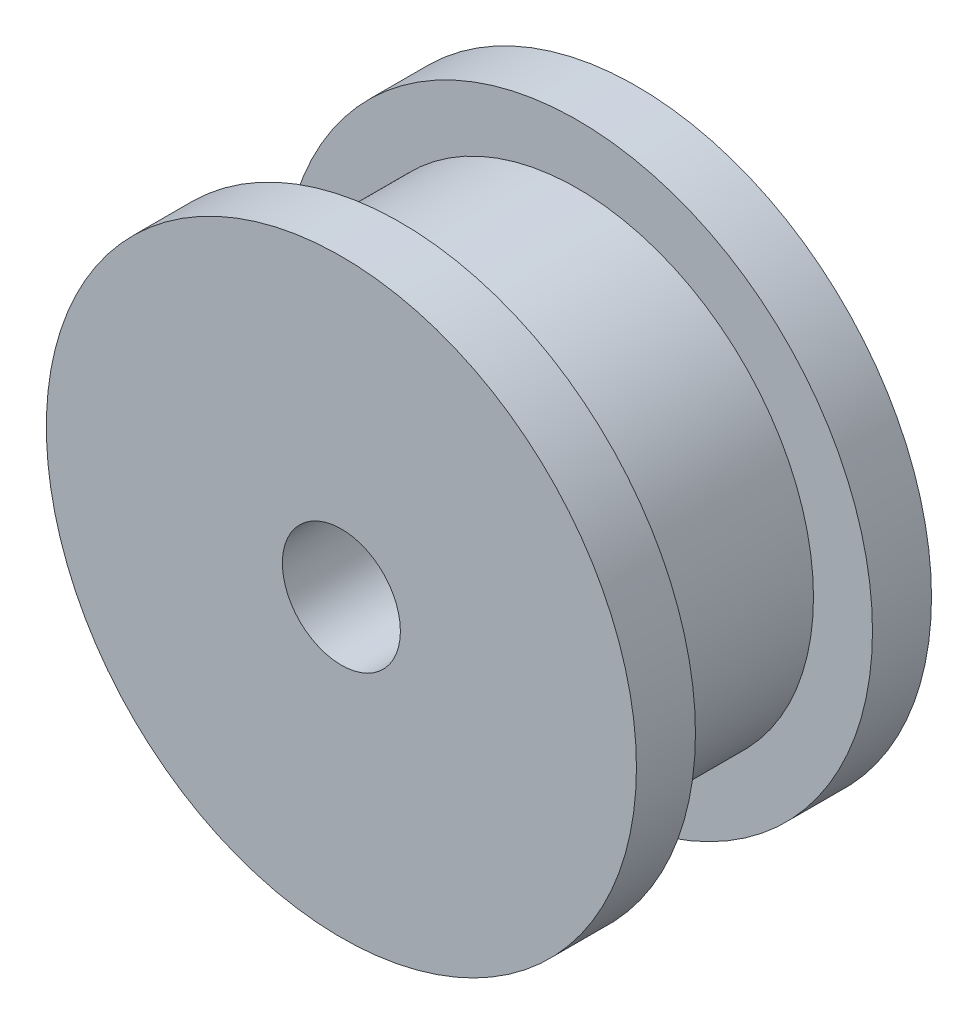
ISO-10303-21;
HEADER;
FILE_DESCRIPTION(('STEP AP214'),'2;1');
FILE_NAME('part.step','',(''),(''),'','','');
FILE_SCHEMA(('AUTOMOTIVE_DESIGN { 1 0 10303 214 1 1 1 1 }'));
ENDSEC;
DATA;
#1=APPLICATION_CONTEXT('core data for automotive mechanical design processes');
#2=APPLICATION_PROTOCOL_DEFINITION('international standard','automotive_design',2000,#1);
#3=PRODUCT_CONTEXT('',#1,'mechanical');
#4=PRODUCT('Part','Part','',(#3));
#5=PRODUCT_RELATED_PRODUCT_CATEGORY('part','',(#4));
#6=PRODUCT_DEFINITION_FORMATION('','',#4);
#7=PRODUCT_DEFINITION_CONTEXT('part definition',#1,'design');
#8=PRODUCT_DEFINITION('design','',#6,#7);
#9=PRODUCT_DEFINITION_SHAPE('','',#8);
#10=(LENGTH_UNIT() NAMED_UNIT(*) SI_UNIT(.MILLI.,.METRE.));
#11=(NAMED_UNIT(*) PLANE_ANGLE_UNIT() SI_UNIT($,.RADIAN.));
#12=(NAMED_UNIT(*) SI_UNIT($,.STERADIAN.) SOLID_ANGLE_UNIT());
#13=UNCERTAINTY_MEASURE_WITH_UNIT(LENGTH_MEASURE(1.E-05),#10,'distance_accuracy_value','');
#14=(GEOMETRIC_REPRESENTATION_CONTEXT(3) GLOBAL_UNCERTAINTY_ASSIGNED_CONTEXT((#13)) GLOBAL_UNIT_ASSIGNED_CONTEXT((#10,
#11,#12)) REPRESENTATION_CONTEXT('',''));
#15=CARTESIAN_POINT('',(0.,0.,0.));
#16=DIRECTION('',(0.,0.,1.));
#17=DIRECTION('',(1.,0.,0.));
#18=AXIS2_PLACEMENT_3D('',#15,#16,#17);
#19=CARTESIAN_POINT('',(0.,0.,50.));
#20=DIRECTION('',(0.,0.,-1.));
#21=DIRECTION('',(-1.,0.,0.));
#22=AXIS2_PLACEMENT_3D('',#19,#20,#21);
#23=CYLINDRICAL_SURFACE('',#22,50.);
#24=CARTESIAN_POINT('',(0.,0.,40.));
#25=DIRECTION('',(0.,0.,1.));
#26=DIRECTION('',(1.,0.,0.));
#27=AXIS2_PLACEMENT_3D('',#24,#25,#26);
#28=CIRCLE('',#27,50.);
#29=CARTESIAN_POINT('',(50.,0.,40.));
#30=VERTEX_POINT('',#29);
#31=EDGE_CURVE('E37',#30,#30,#28,.T.);
#32=ORIENTED_EDGE('',*,*,#31,.T.);
#33=EDGE_LOOP('',(#32));
#34=FACE_BOUND('',#33,.T.);
#35=CARTESIAN_POINT('',(0.,0.,50.));
#36=DIRECTION('',(0.,0.,1.));
#37=DIRECTION('',(1.,0.,0.));
#38=AXIS2_PLACEMENT_3D('',#35,#36,#37);
#39=CIRCLE('',#38,50.);
#40=CARTESIAN_POINT('',(50.,0.,50.));
#41=VERTEX_POINT('',#40);
#42=EDGE_CURVE('E11',#41,#41,#39,.T.);
#43=ORIENTED_EDGE('',*,*,#42,.F.);
#44=EDGE_LOOP('',(#43));
#45=FACE_BOUND('',#44,.T.);
#46=ADVANCED_FACE('F34',(#34,#45),#23,.T.);
#47=CARTESIAN_POINT('',(0.,0.,50.));
#48=DIRECTION('',(0.,0.,1.));
#49=DIRECTION('',(1.,0.,0.));
#50=AXIS2_PLACEMENT_3D('',#47,#48,#49);
#51=PLANE('',#50);
#52=CARTESIAN_POINT('',(0.,0.,50.));
#53=DIRECTION('',(0.,0.,1.));
#54=DIRECTION('',(1.,0.,0.));
#55=AXIS2_PLACEMENT_3D('',#52,#53,#54);
#56=CIRCLE('',#55,10.);
#57=CARTESIAN_POINT('',(10.,0.,50.));
#58=VERTEX_POINT('',#57);
#59=EDGE_CURVE('E64',#58,#58,#56,.T.);
#60=ORIENTED_EDGE('',*,*,#59,.F.);
#61=EDGE_LOOP('',(#60));
#62=FACE_BOUND('',#61,.T.);
#63=ORIENTED_EDGE('',*,*,#42,.T.);
#64=EDGE_LOOP('',(#63));
#65=FACE_BOUND('',#64,.T.);
#66=ADVANCED_FACE('F72',(#62,#65),#51,.T.);
#67=CARTESIAN_POINT('',(0.,0.,40.));
#68=DIRECTION('',(0.,0.,1.));
#69=DIRECTION('',(1.,0.,0.));
#70=AXIS2_PLACEMENT_3D('',#67,#68,#69);
#71=PLANE('',#70);
#72=CARTESIAN_POINT('',(0.,0.,40.));
#73=DIRECTION('',(0.,0.,1.));
#74=DIRECTION('',(1.,0.,0.));
#75=AXIS2_PLACEMENT_3D('',#72,#73,#74);
#76=CIRCLE('',#75,40.);
#77=CARTESIAN_POINT('',(40.,0.,40.));
#78=VERTEX_POINT('',#77);
#79=EDGE_CURVE('E48',#78,#78,#76,.T.);
#80=ORIENTED_EDGE('',*,*,#79,.T.);
#81=EDGE_LOOP('',(#80));
#82=FACE_BOUND('',#81,.T.);
#83=ORIENTED_EDGE('',*,*,#31,.F.);
#84=EDGE_LOOP('',(#83));
#85=FACE_BOUND('',#84,.T.);
#86=ADVANCED_FACE('F74',(#82,#85),#71,.F.);
#87=CARTESIAN_POINT('',(0.,0.,10.));
#88=DIRECTION('',(0.,0.,1.));
#89=DIRECTION('',(1.,0.,0.));
#90=AXIS2_PLACEMENT_3D('',#87,#88,#89);
#91=PLANE('',#90);
#92=CARTESIAN_POINT('',(0.,0.,10.));
#93=DIRECTION('',(0.,0.,1.));
#94=DIRECTION('',(1.,0.,0.));
#95=AXIS2_PLACEMENT_3D('',#92,#93,#94);
#96=CIRCLE('',#95,40.);
#97=CARTESIAN_POINT('',(40.,0.,10.));
#98=VERTEX_POINT('',#97);
#99=EDGE_CURVE('E56',#98,#98,#96,.T.);
#100=ORIENTED_EDGE('',*,*,#99,.F.);
#101=EDGE_LOOP('',(#100));
#102=FACE_BOUND('',#101,.T.);
#103=CARTESIAN_POINT('',(0.,0.,10.));
#104=DIRECTION('',(0.,0.,1.));
#105=DIRECTION('',(1.,0.,0.));
#106=AXIS2_PLACEMENT_3D('',#103,#104,#105);
#107=CIRCLE('',#106,50.);
#108=CARTESIAN_POINT('',(50.,0.,10.));
#109=VERTEX_POINT('',#108);
#110=EDGE_CURVE('E50',#109,#109,#107,.T.);
#111=ORIENTED_EDGE('',*,*,#110,.T.);
#112=EDGE_LOOP('',(#111));
#113=FACE_BOUND('',#112,.T.);
#114=ADVANCED_FACE('F80',(#102,#113),#91,.T.);
#115=CARTESIAN_POINT('',(0.,0.,40.));
#116=DIRECTION('',(0.,0.,-1.));
#117=DIRECTION('',(-1.,0.,0.));
#118=AXIS2_PLACEMENT_3D('',#115,#116,#117);
#119=CYLINDRICAL_SURFACE('',#118,40.);
#120=ORIENTED_EDGE('',*,*,#79,.F.);
#121=EDGE_LOOP('',(#120));
#122=FACE_BOUND('',#121,.T.);
#123=ORIENTED_EDGE('',*,*,#99,.T.);
#124=EDGE_LOOP('',(#123));
#125=FACE_BOUND('',#124,.T.);
#126=ADVANCED_FACE('F87',(#122,#125),#119,.T.);
#127=CARTESIAN_POINT('',(0.,0.,0.));
#128=DIRECTION('',(0.,0.,1.));
#129=DIRECTION('',(1.,0.,0.));
#130=AXIS2_PLACEMENT_3D('',#127,#128,#129);
#131=PLANE('',#130);
#132=CARTESIAN_POINT('',(0.,0.,0.));
#133=DIRECTION('',(0.,0.,1.));
#134=DIRECTION('',(1.,0.,0.));
#135=AXIS2_PLACEMENT_3D('',#132,#133,#134);
#136=CIRCLE('',#135,10.);
#137=CARTESIAN_POINT('',(10.,0.,0.));
#138=VERTEX_POINT('',#137);
#139=EDGE_CURVE('E60',#138,#138,#136,.T.);
#140=ORIENTED_EDGE('',*,*,#139,.T.);
#141=EDGE_LOOP('',(#140));
#142=FACE_BOUND('',#141,.T.);
#143=CARTESIAN_POINT('',(0.,0.,0.));
#144=DIRECTION('',(0.,0.,1.));
#145=DIRECTION('',(1.,0.,0.));
#146=AXIS2_PLACEMENT_3D('',#143,#144,#145);
#147=CIRCLE('',#146,50.);
#148=CARTESIAN_POINT('',(50.,0.,0.));
#149=VERTEX_POINT('',#148);
#150=EDGE_CURVE('E41',#149,#149,#147,.T.);
#151=ORIENTED_EDGE('',*,*,#150,.F.);
#152=EDGE_LOOP('',(#151));
#153=FACE_BOUND('',#152,.T.);
#154=ADVANCED_FACE('F85',(#142,#153),#131,.F.);
#155=ORIENTED_EDGE('',*,*,#150,.T.);
#156=EDGE_LOOP('',(#155));
#157=FACE_BOUND('',#156,.T.);
#158=ORIENTED_EDGE('',*,*,#110,.F.);
#159=EDGE_LOOP('',(#158));
#160=FACE_BOUND('',#159,.T.);
#161=ADVANCED_FACE('F83',(#157,#160),#23,.T.);
#162=CARTESIAN_POINT('',(0.,0.,0.));
#163=DIRECTION('',(0.,0.,1.));
#164=DIRECTION('',(1.,0.,0.));
#165=AXIS2_PLACEMENT_3D('',#162,#163,#164);
#166=CYLINDRICAL_SURFACE('',#165,10.);
#167=ORIENTED_EDGE('',*,*,#139,.F.);
#168=EDGE_LOOP('',(#167));
#169=FACE_BOUND('',#168,.T.);
#170=ORIENTED_EDGE('',*,*,#59,.T.);
#171=EDGE_LOOP('',(#170));
#172=FACE_BOUND('',#171,.T.);
#173=ADVANCED_FACE('F70',(#169,#172),#166,.F.);
#174=CLOSED_SHELL('',(#46,#66,#86,#114,#126,#154,#161,#173));
#175=MANIFOLD_SOLID_BREP('B2',#174);
#176=ADVANCED_BREP_SHAPE_REPRESENTATION('',(#18,#175),#14);
#177=SHAPE_DEFINITION_REPRESENTATION(#9,#176);
ENDSEC;
END-ISO-10303-21;
